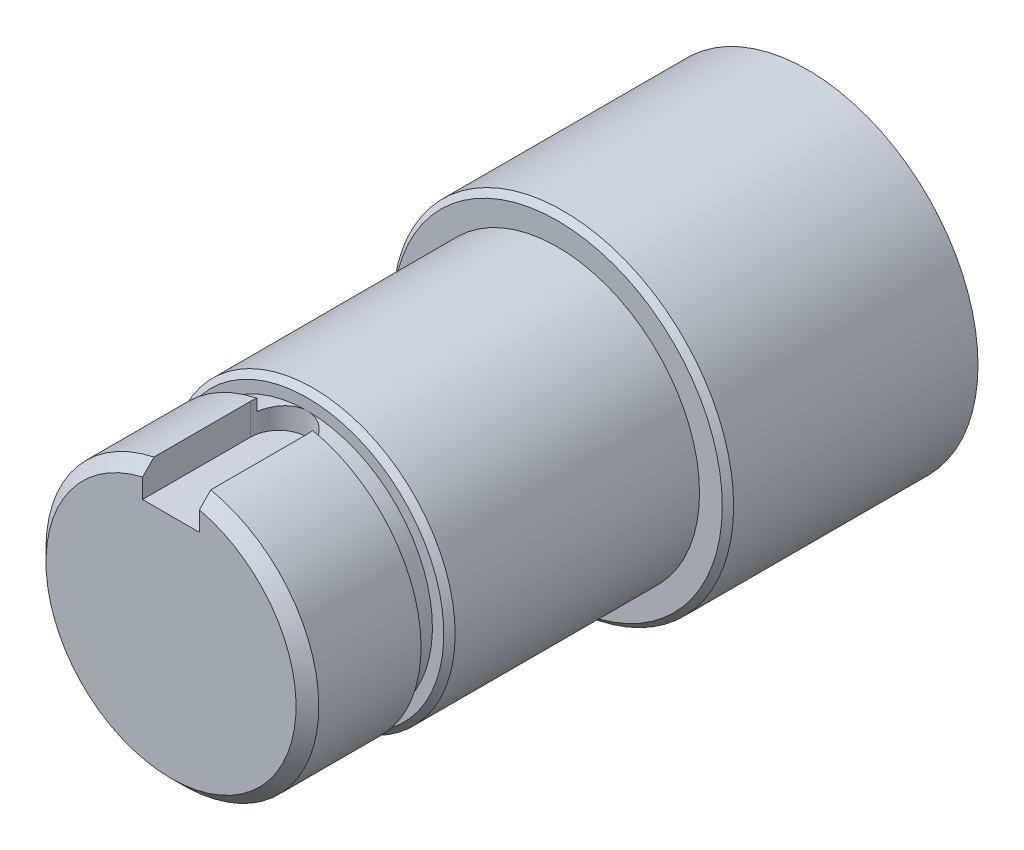
ISO-10303-21;
HEADER;
FILE_DESCRIPTION(('STEP AP214'),'2;1');
FILE_NAME('part.step','',(''),(''),'','','');
FILE_SCHEMA(('AUTOMOTIVE_DESIGN { 1 0 10303 214 1 1 1 1 }'));
ENDSEC;
DATA;
#1=APPLICATION_CONTEXT('core data for automotive mechanical design processes');
#2=APPLICATION_PROTOCOL_DEFINITION('international standard','automotive_design',2000,#1);
#3=PRODUCT_CONTEXT('',#1,'mechanical');
#4=PRODUCT('Part','Part','',(#3));
#5=PRODUCT_RELATED_PRODUCT_CATEGORY('part','',(#4));
#6=PRODUCT_DEFINITION_FORMATION('','',#4);
#7=PRODUCT_DEFINITION_CONTEXT('part definition',#1,'design');
#8=PRODUCT_DEFINITION('design','',#6,#7);
#9=PRODUCT_DEFINITION_SHAPE('','',#8);
#10=(LENGTH_UNIT() NAMED_UNIT(*) SI_UNIT(.MILLI.,.METRE.));
#11=(NAMED_UNIT(*) PLANE_ANGLE_UNIT() SI_UNIT($,.RADIAN.));
#12=(NAMED_UNIT(*) SI_UNIT($,.STERADIAN.) SOLID_ANGLE_UNIT());
#13=UNCERTAINTY_MEASURE_WITH_UNIT(LENGTH_MEASURE(1.E-05),#10,'distance_accuracy_value','');
#14=(GEOMETRIC_REPRESENTATION_CONTEXT(3) GLOBAL_UNCERTAINTY_ASSIGNED_CONTEXT((#13)) GLOBAL_UNIT_ASSIGNED_CONTEXT((#10,
#11,#12)) REPRESENTATION_CONTEXT('',''));
#15=CARTESIAN_POINT('',(0.,0.,0.));
#16=DIRECTION('',(0.,0.,1.));
#17=DIRECTION('',(1.,0.,0.));
#18=AXIS2_PLACEMENT_3D('',#15,#16,#17);
#19=CARTESIAN_POINT('',(0.,0.,0.));
#20=DIRECTION('',(0.,0.,-1.));
#21=DIRECTION('',(-1.,0.,0.));
#22=AXIS2_PLACEMENT_3D('',#19,#20,#21);
#23=PLANE('',#22);
#24=DIRECTION('',(0.,-1.,0.));
#25=VECTOR('',#24,1.);
#26=CARTESIAN_POINT('',(-2.5,15.,0.));
#27=LINE('',#26,#25);
#28=CARTESIAN_POINT('',(-2.5,10.7121426428143,0.));
#29=VERTEX_POINT('',#28);
#30=CARTESIAN_POINT('',(-2.5,9.,0.));
#31=VERTEX_POINT('',#30);
#32=EDGE_CURVE('E111',#29,#31,#27,.T.);
#33=ORIENTED_EDGE('',*,*,#32,.F.);
#34=CARTESIAN_POINT('',(0.,0.,0.));
#35=DIRECTION('',(0.,0.,-1.));
#36=DIRECTION('',(-1.,0.,0.));
#37=AXIS2_PLACEMENT_3D('',#34,#35,#36);
#38=CIRCLE('',#37,11.);
#39=CARTESIAN_POINT('',(2.5,10.7121426428143,0.));
#40=VERTEX_POINT('',#39);
#41=EDGE_CURVE('E200',#29,#40,#38,.F.);
#42=ORIENTED_EDGE('',*,*,#41,.T.);
#43=DIRECTION('',(0.,-1.,0.));
#44=VECTOR('',#43,1.);
#45=CARTESIAN_POINT('',(2.5,15.,0.));
#46=LINE('',#45,#44);
#47=CARTESIAN_POINT('',(2.5,9.,0.));
#48=VERTEX_POINT('',#47);
#49=EDGE_CURVE('E132',#40,#48,#46,.T.);
#50=ORIENTED_EDGE('',*,*,#49,.T.);
#51=DIRECTION('',(1.,0.,0.));
#52=VECTOR('',#51,1.);
#53=CARTESIAN_POINT('',(2.5,9.,0.));
#54=LINE('',#53,#52);
#55=EDGE_CURVE('E120',#31,#48,#54,.T.);
#56=ORIENTED_EDGE('',*,*,#55,.F.);
#57=EDGE_LOOP('',(#33,#42,#50,#56));
#58=FACE_BOUND('',#57,.T.);
#59=ADVANCED_FACE('F37',(#58),#23,.F.);
#60=CARTESIAN_POINT('',(0.,0.,0.));
#61=DIRECTION('',(0.,0.,1.));
#62=DIRECTION('',(1.,0.,0.));
#63=AXIS2_PLACEMENT_3D('',#60,#61,#62);
#64=CYLINDRICAL_SURFACE('',#63,12.);
#65=DIRECTION('',(0.,0.,1.));
#66=VECTOR('',#65,1.);
#67=CARTESIAN_POINT('',(2.5,11.7366945943055,0.));
#68=LINE('',#67,#66);
#69=CARTESIAN_POINT('',(2.5,11.7366945943055,-1.00000000000002));
#70=VERTEX_POINT('',#69);
#71=CARTESIAN_POINT('',(2.5,11.7366945943055,-9.5));
#72=VERTEX_POINT('',#71);
#73=EDGE_CURVE('E196',#70,#72,#68,.F.);
#74=ORIENTED_EDGE('',*,*,#73,.F.);
#75=CARTESIAN_POINT('',(0.,0.,-1.00000000000002));
#76=DIRECTION('',(0.,0.,-1.));
#77=DIRECTION('',(-1.,0.,0.));
#78=AXIS2_PLACEMENT_3D('',#75,#76,#77);
#79=CIRCLE('',#78,12.);
#80=CARTESIAN_POINT('',(-2.5,11.7366945943055,-1.00000000000002));
#81=VERTEX_POINT('',#80);
#82=EDGE_CURVE('E53',#70,#81,#79,.T.);
#83=ORIENTED_EDGE('',*,*,#82,.T.);
#84=DIRECTION('',(0.,0.,1.));
#85=VECTOR('',#84,1.);
#86=CARTESIAN_POINT('',(-2.5,11.7366945943055,0.));
#87=LINE('',#86,#85);
#88=CARTESIAN_POINT('',(-2.5,11.7366945943055,-9.5));
#89=VERTEX_POINT('',#88);
#90=EDGE_CURVE('E198',#89,#81,#87,.T.);
#91=ORIENTED_EDGE('',*,*,#90,.F.);
#92=CARTESIAN_POINT('',(-2.44948974278318,11.7473401244707,-10.));
#93=CARTESIAN_POINT('',(-2.46630138988501,11.74381112007,-9.91755191996268));
#94=CARTESIAN_POINT('',(-2.47891640153729,11.7411594903559,-9.83466121341523));
#95=CARTESIAN_POINT('',(-2.49575315399786,11.7376109802893,-9.66799454675437));
#96=CARTESIAN_POINT('',(-2.49997489475119,11.7367140999484,-9.58421858663514));
#97=CARTESIAN_POINT('',(-2.5,11.7366945943055,-9.5));
#98=B_SPLINE_CURVE_WITH_KNOTS('',3,(#92,#93,#94,#95,#96,#97),.UNSPECIFIED.,.F.,.F.,(4,2,4),(0.,
0.251661180994523,0.503322363637159),.UNSPECIFIED.);
#99=CARTESIAN_POINT('',(-2.44948974278318,11.7473401244707,-10.));
#100=VERTEX_POINT('',#99);
#101=EDGE_CURVE('E108',#100,#89,#98,.T.);
#102=ORIENTED_EDGE('',*,*,#101,.F.);
#103=CARTESIAN_POINT('',(0.,0.,-10.));
#104=DIRECTION('',(0.,0.,1.));
#105=DIRECTION('',(1.,0.,0.));
#106=AXIS2_PLACEMENT_3D('',#103,#104,#105);
#107=CIRCLE('',#106,12.);
#108=CARTESIAN_POINT('',(2.44948974278318,11.7473401244707,-10.));
#109=VERTEX_POINT('',#108);
#110=EDGE_CURVE('E193',#100,#109,#107,.T.);
#111=ORIENTED_EDGE('',*,*,#110,.T.);
#112=CARTESIAN_POINT('',(2.5,11.7366945943055,-9.5));
#113=CARTESIAN_POINT('',(2.49997489475119,11.7367140999484,-9.58421858663514));
#114=CARTESIAN_POINT('',(2.49575315399786,11.7376109802893,-9.66799454675437));
#115=CARTESIAN_POINT('',(2.47891640153729,11.7411594903559,-9.83466121341523));
#116=CARTESIAN_POINT('',(2.46630138988501,11.74381112007,-9.91755191996268));
#117=CARTESIAN_POINT('',(2.44948974278318,11.7473401244707,-10.));
#118=B_SPLINE_CURVE_WITH_KNOTS('',3,(#112,#113,#114,#115,#116,#117),.UNSPECIFIED.,.F.,.F.,(4,2,
4),(0.,0.251661182642636,0.503322363637159),.UNSPECIFIED.);
#119=EDGE_CURVE('E175',#72,#109,#118,.T.);
#120=ORIENTED_EDGE('',*,*,#119,.F.);
#121=EDGE_LOOP('',(#74,#83,#91,#102,#111,#120));
#122=FACE_BOUND('',#121,.T.);
#123=ADVANCED_FACE('F168',(#122),#64,.T.);
#124=CARTESIAN_POINT('',(0.,12.,-10.));
#125=DIRECTION('',(0.,0.,1.));
#126=DIRECTION('',(1.,0.,0.));
#127=AXIS2_PLACEMENT_3D('',#124,#125,#126);
#128=PLANE('',#127);
#129=DIRECTION('',(0.,-1.,0.));
#130=VECTOR('',#129,1.);
#131=CARTESIAN_POINT('',(-2.44948974278318,15.,-10.));
#132=LINE('',#131,#130);
#133=CARTESIAN_POINT('',(-2.44948974278318,10.7238052947636,-10.));
#134=VERTEX_POINT('',#133);
#135=EDGE_CURVE('E142',#134,#100,#132,.F.);
#136=ORIENTED_EDGE('',*,*,#135,.F.);
#137=CARTESIAN_POINT('',(0.,0.,-10.));
#138=DIRECTION('',(0.,0.,1.));
#139=DIRECTION('',(1.,0.,0.));
#140=AXIS2_PLACEMENT_3D('',#137,#138,#139);
#141=CIRCLE('',#140,11.);
#142=CARTESIAN_POINT('',(2.44948974278318,10.7238052947636,-10.));
#143=VERTEX_POINT('',#142);
#144=EDGE_CURVE('E190',#134,#143,#141,.T.);
#145=ORIENTED_EDGE('',*,*,#144,.T.);
#146=DIRECTION('',(0.,-1.,0.));
#147=VECTOR('',#146,1.);
#148=CARTESIAN_POINT('',(2.44948974278318,15.,-10.));
#149=LINE('',#148,#147);
#150=EDGE_CURVE('E167',#109,#143,#149,.T.);
#151=ORIENTED_EDGE('',*,*,#150,.F.);
#152=ORIENTED_EDGE('',*,*,#110,.F.);
#153=EDGE_LOOP('',(#136,#145,#151,#152));
#154=FACE_BOUND('',#153,.T.);
#155=ADVANCED_FACE('F172',(#154),#128,.F.);
#156=CARTESIAN_POINT('',(0.,0.,0.));
#157=DIRECTION('',(0.,0.,1.));
#158=DIRECTION('',(1.,0.,0.));
#159=AXIS2_PLACEMENT_3D('',#156,#157,#158);
#160=CYLINDRICAL_SURFACE('',#159,11.);
#161=CARTESIAN_POINT('',(2.44948974278318,10.7238052947636,-10.));
#162=CARTESIAN_POINT('',(2.43546029800012,10.7270056140935,-10.0687658541219));
#163=CARTESIAN_POINT('',(2.41852849317044,10.7308483129835,-10.1369024025991));
#164=CARTESIAN_POINT('',(2.37903219978379,10.7396759330596,-10.2714339922325));
#165=CARTESIAN_POINT('',(2.35646875776077,10.7446606420105,-10.3378293544249));
#166=CARTESIAN_POINT('',(2.3059117370436,10.7556232664351,-10.4683290356998));
#167=CARTESIAN_POINT('',(2.27792589842313,10.7615997644778,-10.5324364679775));
#168=CARTESIAN_POINT('',(2.21673402022404,10.7743708943376,-10.6580046328132));
#169=CARTESIAN_POINT('',(2.18352785049374,10.7811655465517,-10.7194652993342));
#170=CARTESIAN_POINT('',(2.07643102930596,10.802487441033,-10.8992302745031));
#171=CARTESIAN_POINT('',(1.99500860974427,10.8179647932573,-11.0130549552139));
#172=CARTESIAN_POINT('',(1.81446040223466,10.8497057285349,-11.2254548650035));
#173=CARTESIAN_POINT('',(1.7153321494977,10.8659694208225,-11.3240279673745));
#174=CARTESIAN_POINT('',(1.50048852036224,10.8977273916412,-11.5046141676335));
#175=CARTESIAN_POINT('',(1.38456569984476,10.913208181084,-11.5863835486118));
#176=CARTESIAN_POINT('',(1.1403141507048,10.9414247771705,-11.7292834613016));
#177=CARTESIAN_POINT('',(1.01198530340163,10.9541605575508,-11.7904137955471));
#178=CARTESIAN_POINT('',(0.747502423487413,10.9753675759204,-11.8897789476618));
#179=CARTESIAN_POINT('',(0.611413782178588,10.9838698657884,-11.9281808789883));
#180=CARTESIAN_POINT('',(0.334509194933947,10.9957850389368,-11.9815268235188));
#181=CARTESIAN_POINT('',(0.193694176233571,10.9991989145795,-11.9964754107153));
#182=CARTESIAN_POINT('',(-0.0853038567361116,11.0005342905738,-12.0023505810677));
#183=CARTESIAN_POINT('',(-0.223475426347413,10.9985767376126,-11.9938061401631));
#184=CARTESIAN_POINT('',(-0.496360415596154,10.9896436624435,-11.9541061833004));
#185=CARTESIAN_POINT('',(-0.631073804226792,10.9826680952593,-11.9229504646779));
#186=CARTESIAN_POINT('',(-0.892877436761515,10.9644859951713,-11.8391470519055));
#187=CARTESIAN_POINT('',(-1.0199891382797,10.9532920930025,-11.7865634801624));
#188=CARTESIAN_POINT('',(-1.26364984056604,10.9278640241393,-11.6614690078716));
#189=CARTESIAN_POINT('',(-1.38019850029136,10.9136297593323,-11.5889574642254));
#190=CARTESIAN_POINT('',(-1.60201524380023,10.8833059648609,-11.4243216269016));
#191=CARTESIAN_POINT('',(-1.70700339971072,10.8671844082587,-11.3318260593767));
#192=CARTESIAN_POINT('',(-1.90018320188437,10.8350782584726,-11.1305726501863));
#193=CARTESIAN_POINT('',(-1.98836486460063,10.8190937520506,-11.0218052105985));
#194=CARTESIAN_POINT('',(-2.1466231859416,10.7888185846139,-10.7892227814058));
#195=CARTESIAN_POINT('',(-2.21641509231995,10.7745562305443,-10.6652103520707));
#196=CARTESIAN_POINT('',(-2.33394491521172,10.7497143390022,-10.4070406302536));
#197=CARTESIAN_POINT('',(-2.38173370476181,10.7391263202757,-10.2729075824992));
#198=CARTESIAN_POINT('',(-2.42964225460226,10.7283244592824,-10.0907827016322));
#199=CARTESIAN_POINT('',(-2.44020769271175,10.7259222401423,-10.0455175386513));
#200=CARTESIAN_POINT('',(-2.44948974278318,10.7238052947636,-10.));
#201=B_SPLINE_CURVE_WITH_KNOTS('',3,(#161,#162,#163,#164,#165,#166,#167,#168,#169,#170,#171,
#172,#173,#174,#175,#176,#177,#178,#179,#180,#181,#182,#183,#184,#185,#186,#187,#188,#189,#190,
#191,#192,#193,#194,#195,#196,#197,#198,#199,#200),.UNSPECIFIED.,.F.,.F.,(4,2,2,2,2,2,2,2,2,2,2,
2,2,2,2,2,2,2,2,4),(0.,0.21068958324773,0.421340042908845,0.631692000703381,0.842049203760208,
1.26232536136261,1.68266007032214,2.10871720228515,2.5347784104734,2.95766672725566,
3.38047255991519,3.79383680545741,4.20720475601969,4.61934469068557,5.03149792713857,
5.45209251439054,5.87293617364216,6.29995715537314,6.72598580895303,6.86553673386692),.UNSPECIFIED.);
#202=CARTESIAN_POINT('',(0.,11.,-12.));
#203=VERTEX_POINT('',#202);
#204=EDGE_CURVE('E143',#143,#203,#201,.T.);
#205=ORIENTED_EDGE('',*,*,#204,.F.);
#206=ORIENTED_EDGE('',*,*,#144,.F.);
#207=EDGE_CURVE('E110',#203,#134,#201,.T.);
#208=ORIENTED_EDGE('',*,*,#207,.F.);
#209=CARTESIAN_POINT('',(0.,0.,-12.));
#210=DIRECTION('',(0.,0.,1.));
#211=DIRECTION('',(1.,0.,0.));
#212=AXIS2_PLACEMENT_3D('',#209,#210,#211);
#213=CIRCLE('',#212,11.);
#214=EDGE_CURVE('E187',#203,#203,#213,.T.);
#215=ORIENTED_EDGE('',*,*,#214,.T.);
#216=EDGE_LOOP('',(#205,#206,#208,#215));
#217=FACE_BOUND('',#216,.T.);
#218=ADVANCED_FACE('F145',(#217),#160,.T.);
#219=CARTESIAN_POINT('',(0.,11.,-12.));
#220=DIRECTION('',(0.,0.,-1.));
#221=DIRECTION('',(-1.,0.,0.));
#222=AXIS2_PLACEMENT_3D('',#219,#220,#221);
#223=PLANE('',#222);
#224=CARTESIAN_POINT('',(0.,0.,-12.));
#225=DIRECTION('',(0.,0.,-1.));
#226=DIRECTION('',(-1.,0.,0.));
#227=AXIS2_PLACEMENT_3D('',#224,#225,#226);
#228=CIRCLE('',#227,12.);
#229=CARTESIAN_POINT('',(-12.,0.,-12.));
#230=VERTEX_POINT('',#229);
#231=EDGE_CURVE('E227',#230,#230,#228,.F.);
#232=ORIENTED_EDGE('',*,*,#231,.T.);
#233=EDGE_LOOP('',(#232));
#234=FACE_BOUND('',#233,.T.);
#235=ORIENTED_EDGE('',*,*,#214,.F.);
#236=EDGE_LOOP('',(#235));
#237=FACE_BOUND('',#236,.T.);
#238=ADVANCED_FACE('F262',(#234,#237),#223,.F.);
#239=CARTESIAN_POINT('',(0.,0.,0.));
#240=DIRECTION('',(0.,0.,1.));
#241=DIRECTION('',(1.,0.,0.));
#242=AXIS2_PLACEMENT_3D('',#239,#240,#241);
#243=CYLINDRICAL_SURFACE('',#242,12.5);
#244=CARTESIAN_POINT('',(0.,0.,-12.5));
#245=DIRECTION('',(0.,0.,-1.));
#246=DIRECTION('',(-1.,0.,0.));
#247=AXIS2_PLACEMENT_3D('',#244,#245,#246);
#248=CIRCLE('',#247,12.5);
#249=CARTESIAN_POINT('',(-12.5,0.,-12.5));
#250=VERTEX_POINT('',#249);
#251=EDGE_CURVE('E230',#250,#250,#248,.T.);
#252=ORIENTED_EDGE('',*,*,#251,.T.);
#253=EDGE_LOOP('',(#252));
#254=FACE_BOUND('',#253,.T.);
#255=CARTESIAN_POINT('',(0.,0.,-34.));
#256=DIRECTION('',(0.,0.,1.));
#257=DIRECTION('',(1.,0.,0.));
#258=AXIS2_PLACEMENT_3D('',#255,#256,#257);
#259=CIRCLE('',#258,12.5);
#260=CARTESIAN_POINT('',(12.5,0.,-34.));
#261=VERTEX_POINT('',#260);
#262=EDGE_CURVE('E184',#261,#261,#259,.T.);
#263=ORIENTED_EDGE('',*,*,#262,.T.);
#264=EDGE_LOOP('',(#263));
#265=FACE_BOUND('',#264,.T.);
#266=ADVANCED_FACE('F264',(#254,#265),#243,.T.);
#267=CARTESIAN_POINT('',(0.,12.5,-34.));
#268=DIRECTION('',(0.,0.,-1.));
#269=DIRECTION('',(-1.,0.,0.));
#270=AXIS2_PLACEMENT_3D('',#267,#268,#269);
#271=PLANE('',#270);
#272=CARTESIAN_POINT('',(0.,0.,-34.));
#273=DIRECTION('',(0.,0.,-1.));
#274=DIRECTION('',(-1.,0.,0.));
#275=AXIS2_PLACEMENT_3D('',#272,#273,#274);
#276=CIRCLE('',#275,14.5);
#277=CARTESIAN_POINT('',(-14.5,0.,-34.));
#278=VERTEX_POINT('',#277);
#279=EDGE_CURVE('E46',#278,#278,#276,.F.);
#280=ORIENTED_EDGE('',*,*,#279,.T.);
#281=EDGE_LOOP('',(#280));
#282=FACE_BOUND('',#281,.T.);
#283=ORIENTED_EDGE('',*,*,#262,.F.);
#284=EDGE_LOOP('',(#283));
#285=FACE_BOUND('',#284,.T.);
#286=ADVANCED_FACE('F235',(#282,#285),#271,.F.);
#287=CARTESIAN_POINT('',(0.,0.,0.));
#288=DIRECTION('',(0.,0.,1.));
#289=DIRECTION('',(1.,0.,0.));
#290=AXIS2_PLACEMENT_3D('',#287,#288,#289);
#291=CYLINDRICAL_SURFACE('',#290,15.);
#292=CARTESIAN_POINT('',(0.,0.,-34.5));
#293=DIRECTION('',(0.,0.,-1.));
#294=DIRECTION('',(-1.,0.,0.));
#295=AXIS2_PLACEMENT_3D('',#292,#293,#294);
#296=CIRCLE('',#295,15.);
#297=CARTESIAN_POINT('',(-15.,0.,-34.5));
#298=VERTEX_POINT('',#297);
#299=EDGE_CURVE('E11',#298,#298,#296,.T.);
#300=ORIENTED_EDGE('',*,*,#299,.T.);
#301=EDGE_LOOP('',(#300));
#302=FACE_BOUND('',#301,.T.);
#303=CARTESIAN_POINT('',(0.,0.,-56.));
#304=DIRECTION('',(0.,0.,1.));
#305=DIRECTION('',(1.,0.,0.));
#306=AXIS2_PLACEMENT_3D('',#303,#304,#305);
#307=CIRCLE('',#306,15.);
#308=CARTESIAN_POINT('',(15.,0.,-56.));
#309=VERTEX_POINT('',#308);
#310=EDGE_CURVE('E181',#309,#309,#307,.T.);
#311=ORIENTED_EDGE('',*,*,#310,.T.);
#312=EDGE_LOOP('',(#311));
#313=FACE_BOUND('',#312,.T.);
#314=ADVANCED_FACE('F274',(#302,#313),#291,.T.);
#315=CARTESIAN_POINT('',(0.,15.,-56.));
#316=DIRECTION('',(0.,0.,1.));
#317=DIRECTION('',(1.,0.,0.));
#318=AXIS2_PLACEMENT_3D('',#315,#316,#317);
#319=PLANE('',#318);
#320=ORIENTED_EDGE('',*,*,#310,.F.);
#321=EDGE_LOOP('',(#320));
#322=FACE_BOUND('',#321,.T.);
#323=ADVANCED_FACE('F156',(#322),#319,.F.);
#324=CARTESIAN_POINT('',(-2.5,15.,-9.5));
#325=DIRECTION('',(1.,0.,0.));
#326=DIRECTION('',(0.,0.,-1.));
#327=AXIS2_PLACEMENT_3D('',#324,#325,#326);
#328=PLANE('',#327);
#329=ORIENTED_EDGE('',*,*,#90,.T.);
#330=CARTESIAN_POINT('',(-2.5,11.7366945943055,-1.00000000000002));
#331=CARTESIAN_POINT('',(-2.5,11.566115981769,-0.833148871139647));
#332=CARTESIAN_POINT('',(-2.5,11.395447347294,-0.666389974432042));
#333=CARTESIAN_POINT('',(-2.5,11.0539300301348,-0.333056641094022));
#334=CARTESIAN_POINT('',(-2.5,10.8830813474461,-0.166482204468287));
#335=CARTESIAN_POINT('',(-2.5,10.7121426428143,0.));
#336=B_SPLINE_CURVE_WITH_KNOTS('',3,(#330,#331,#332,#333,#334,#335),.UNSPECIFIED.,.F.,.F.,(4,2,
4),(0.,0.715839934498148,1.43167988715721),.UNSPECIFIED.);
#337=EDGE_CURVE('E221',#81,#29,#336,.T.);
#338=ORIENTED_EDGE('',*,*,#337,.T.);
#339=ORIENTED_EDGE('',*,*,#32,.T.);
#340=DIRECTION('',(0.,0.,1.));
#341=VECTOR('',#340,1.);
#342=CARTESIAN_POINT('',(-2.5,9.,-9.5));
#343=LINE('',#342,#341);
#344=CARTESIAN_POINT('',(-2.5,9.,-9.5));
#345=VERTEX_POINT('',#344);
#346=EDGE_CURVE('E114',#345,#31,#343,.T.);
#347=ORIENTED_EDGE('',*,*,#346,.F.);
#348=DIRECTION('',(0.,-1.,0.));
#349=VECTOR('',#348,1.);
#350=CARTESIAN_POINT('',(-2.5,15.,-9.5));
#351=LINE('',#350,#349);
#352=EDGE_CURVE('E101',#89,#345,#351,.T.);
#353=ORIENTED_EDGE('',*,*,#352,.F.);
#354=EDGE_LOOP('',(#329,#338,#339,#347,#353));
#355=FACE_BOUND('',#354,.T.);
#356=ADVANCED_FACE('F115',(#355),#328,.T.);
#357=CARTESIAN_POINT('',(2.5,15.,-9.5));
#358=DIRECTION('',(-1.,0.,0.));
#359=DIRECTION('',(0.,0.,1.));
#360=AXIS2_PLACEMENT_3D('',#357,#358,#359);
#361=PLANE('',#360);
#362=ORIENTED_EDGE('',*,*,#49,.F.);
#363=CARTESIAN_POINT('',(2.5,10.7121426428143,0.));
#364=CARTESIAN_POINT('',(2.5,10.8830813474461,-0.166482204468287));
#365=CARTESIAN_POINT('',(2.5,11.0539300301348,-0.333056641094022));
#366=CARTESIAN_POINT('',(2.5,11.395447347294,-0.666389974432043));
#367=CARTESIAN_POINT('',(2.5,11.566115981769,-0.833148871139648));
#368=CARTESIAN_POINT('',(2.5,11.7366945943055,-1.00000000000002));
#369=B_SPLINE_CURVE_WITH_KNOTS('',3,(#363,#364,#365,#366,#367,#368),.UNSPECIFIED.,.F.,.F.,(4,2,
4),(0.,0.715839952659059,1.43167988715721),.UNSPECIFIED.);
#370=EDGE_CURVE('E61',#40,#70,#369,.T.);
#371=ORIENTED_EDGE('',*,*,#370,.T.);
#372=ORIENTED_EDGE('',*,*,#73,.T.);
#373=DIRECTION('',(0.,-1.,0.));
#374=VECTOR('',#373,1.);
#375=CARTESIAN_POINT('',(2.5,15.,-9.5));
#376=LINE('',#375,#374);
#377=CARTESIAN_POINT('',(2.5,9.,-9.5));
#378=VERTEX_POINT('',#377);
#379=EDGE_CURVE('E130',#72,#378,#376,.T.);
#380=ORIENTED_EDGE('',*,*,#379,.T.);
#381=DIRECTION('',(0.,0.,-1.));
#382=VECTOR('',#381,1.);
#383=CARTESIAN_POINT('',(2.5,9.,-9.5));
#384=LINE('',#383,#382);
#385=EDGE_CURVE('E125',#48,#378,#384,.T.);
#386=ORIENTED_EDGE('',*,*,#385,.F.);
#387=EDGE_LOOP('',(#362,#371,#372,#380,#386));
#388=FACE_BOUND('',#387,.T.);
#389=ADVANCED_FACE('F153',(#388),#361,.T.);
#390=CARTESIAN_POINT('',(0.,15.,-9.5));
#391=DIRECTION('',(0.,-1.,0.));
#392=DIRECTION('',(0.,0.,-1.));
#393=AXIS2_PLACEMENT_3D('',#390,#391,#392);
#394=CYLINDRICAL_SURFACE('',#393,2.5);
#395=ORIENTED_EDGE('',*,*,#119,.T.);
#396=ORIENTED_EDGE('',*,*,#150,.T.);
#397=ORIENTED_EDGE('',*,*,#204,.T.);
#398=ORIENTED_EDGE('',*,*,#207,.T.);
#399=ORIENTED_EDGE('',*,*,#135,.T.);
#400=ORIENTED_EDGE('',*,*,#101,.T.);
#401=ORIENTED_EDGE('',*,*,#352,.T.);
#402=CARTESIAN_POINT('',(0.,9.,-9.5));
#403=DIRECTION('',(0.,1.,0.));
#404=DIRECTION('',(0.,0.,1.));
#405=AXIS2_PLACEMENT_3D('',#402,#403,#404);
#406=CIRCLE('',#405,2.5);
#407=EDGE_CURVE('E106',#378,#345,#406,.T.);
#408=ORIENTED_EDGE('',*,*,#407,.F.);
#409=ORIENTED_EDGE('',*,*,#379,.F.);
#410=EDGE_LOOP('',(#395,#396,#397,#398,#399,#400,#401,#408,#409));
#411=FACE_BOUND('',#410,.T.);
#412=ADVANCED_FACE('F103',(#411),#394,.F.);
#413=CARTESIAN_POINT('',(0.,9.,-9.5));
#414=DIRECTION('',(0.,1.,0.));
#415=DIRECTION('',(0.,0.,1.));
#416=AXIS2_PLACEMENT_3D('',#413,#414,#415);
#417=PLANE('',#416);
#418=ORIENTED_EDGE('',*,*,#407,.T.);
#419=ORIENTED_EDGE('',*,*,#346,.T.);
#420=ORIENTED_EDGE('',*,*,#55,.T.);
#421=ORIENTED_EDGE('',*,*,#385,.T.);
#422=EDGE_LOOP('',(#418,#419,#420,#421));
#423=FACE_BOUND('',#422,.T.);
#424=ADVANCED_FACE('F123',(#423),#417,.T.);
#425=CARTESIAN_POINT('',(0.,0.,0.));
#426=DIRECTION('',(0.,0.,-1.));
#427=DIRECTION('',(-1.,0.,0.));
#428=AXIS2_PLACEMENT_3D('',#425,#426,#427);
#429=CONICAL_SURFACE('',#428,11.,0.785398163397441);
#430=ORIENTED_EDGE('',*,*,#337,.F.);
#431=ORIENTED_EDGE('',*,*,#82,.F.);
#432=ORIENTED_EDGE('',*,*,#370,.F.);
#433=ORIENTED_EDGE('',*,*,#41,.F.);
#434=EDGE_LOOP('',(#430,#431,#432,#433));
#435=FACE_BOUND('',#434,.T.);
#436=ADVANCED_FACE('F212',(#435),#429,.T.);
#437=CARTESIAN_POINT('',(0.,0.,-12.));
#438=DIRECTION('',(0.,0.,-1.));
#439=DIRECTION('',(-1.,0.,0.));
#440=AXIS2_PLACEMENT_3D('',#437,#438,#439);
#441=CONICAL_SURFACE('',#440,12.,0.785398163397447);
#442=ORIENTED_EDGE('',*,*,#251,.F.);
#443=EDGE_LOOP('',(#442));
#444=FACE_BOUND('',#443,.T.);
#445=ORIENTED_EDGE('',*,*,#231,.F.);
#446=EDGE_LOOP('',(#445));
#447=FACE_BOUND('',#446,.T.);
#448=ADVANCED_FACE('F218',(#444,#447),#441,.T.);
#449=CARTESIAN_POINT('',(0.,0.,-34.));
#450=DIRECTION('',(0.,0.,-1.));
#451=DIRECTION('',(-1.,0.,0.));
#452=AXIS2_PLACEMENT_3D('',#449,#450,#451);
#453=CONICAL_SURFACE('',#452,14.5,0.785398163397443);
#454=ORIENTED_EDGE('',*,*,#299,.F.);
#455=EDGE_LOOP('',(#454));
#456=FACE_BOUND('',#455,.T.);
#457=ORIENTED_EDGE('',*,*,#279,.F.);
#458=EDGE_LOOP('',(#457));
#459=FACE_BOUND('',#458,.T.);
#460=ADVANCED_FACE('F40',(#456,#459),#453,.T.);
#461=CLOSED_SHELL('',(#59,#123,#155,#218,#238,#266,#286,#314,#323,#356,#389,#412,#424,#436,#448,#460));
#462=MANIFOLD_SOLID_BREP('B2',#461);
#463=ADVANCED_BREP_SHAPE_REPRESENTATION('',(#18,#462),#14);
#464=SHAPE_DEFINITION_REPRESENTATION(#9,#463);
ENDSEC;
END-ISO-10303-21;
